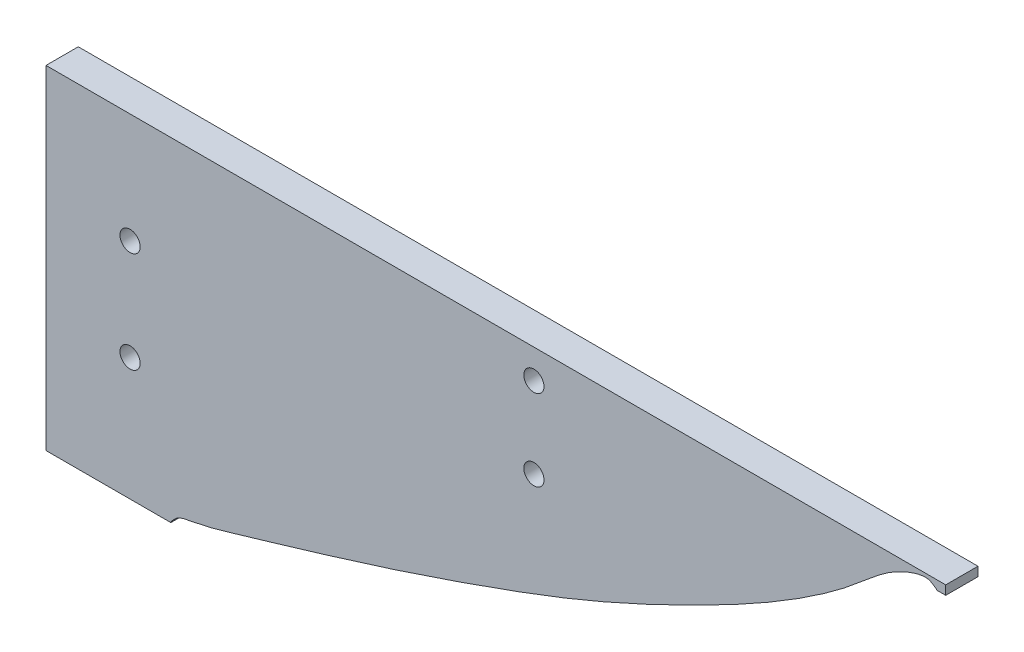
ISO-10303-21;
HEADER;
FILE_DESCRIPTION(('STEP AP214'),'2;1');
FILE_NAME('part.step','',(''),(''),'','','');
FILE_SCHEMA(('AUTOMOTIVE_DESIGN { 1 0 10303 214 1 1 1 1 }'));
ENDSEC;
DATA;
#1=APPLICATION_CONTEXT('core data for automotive mechanical design processes');
#2=APPLICATION_PROTOCOL_DEFINITION('international standard','automotive_design',2000,#1);
#3=PRODUCT_CONTEXT('',#1,'mechanical');
#4=PRODUCT('Part','Part','',(#3));
#5=PRODUCT_RELATED_PRODUCT_CATEGORY('part','',(#4));
#6=PRODUCT_DEFINITION_FORMATION('','',#4);
#7=PRODUCT_DEFINITION_CONTEXT('part definition',#1,'design');
#8=PRODUCT_DEFINITION('design','',#6,#7);
#9=PRODUCT_DEFINITION_SHAPE('','',#8);
#10=(LENGTH_UNIT() NAMED_UNIT(*) SI_UNIT(.MILLI.,.METRE.));
#11=(NAMED_UNIT(*) PLANE_ANGLE_UNIT() SI_UNIT($,.RADIAN.));
#12=(NAMED_UNIT(*) SI_UNIT($,.STERADIAN.) SOLID_ANGLE_UNIT());
#13=UNCERTAINTY_MEASURE_WITH_UNIT(LENGTH_MEASURE(1.E-05),#10,'distance_accuracy_value','');
#14=(GEOMETRIC_REPRESENTATION_CONTEXT(3) GLOBAL_UNCERTAINTY_ASSIGNED_CONTEXT((#13)) GLOBAL_UNIT_ASSIGNED_CONTEXT((#10,
#11,#12)) REPRESENTATION_CONTEXT('',''));
#15=CARTESIAN_POINT('',(0.,0.,0.));
#16=DIRECTION('',(0.,0.,1.));
#17=DIRECTION('',(1.,0.,0.));
#18=AXIS2_PLACEMENT_3D('',#15,#16,#17);
#19=CARTESIAN_POINT('',(8.85789585691385,-47.3159934518362,188.));
#20=DIRECTION('',(0.,0.,-1.));
#21=DIRECTION('',(-1.,0.,0.));
#22=AXIS2_PLACEMENT_3D('',#19,#20,#21);
#23=PLANE('',#22);
#24=CARTESIAN_POINT('',(-100.,-50.,188.));
#25=DIRECTION('',(0.,0.,-1.));
#26=DIRECTION('',(-1.,0.,0.));
#27=AXIS2_PLACEMENT_3D('',#24,#25,#26);
#28=CIRCLE('',#27,2.5);
#29=CARTESIAN_POINT('',(-102.5,-50.,188.));
#30=VERTEX_POINT('',#29);
#31=EDGE_CURVE('E249',#30,#30,#28,.F.);
#32=ORIENTED_EDGE('',*,*,#31,.F.);
#33=EDGE_LOOP('',(#32));
#34=FACE_BOUND('',#33,.T.);
#35=CARTESIAN_POINT('',(0.0705666698621599,-4.96037406111782,188.));
#36=DIRECTION('',(0.,0.,-1.));
#37=DIRECTION('',(-1.,0.,0.));
#38=AXIS2_PLACEMENT_3D('',#35,#36,#37);
#39=CIRCLE('',#38,2.5);
#40=CARTESIAN_POINT('',(-2.42943333013784,-4.96037406111782,188.));
#41=VERTEX_POINT('',#40);
#42=EDGE_CURVE('E159',#41,#41,#39,.F.);
#43=ORIENTED_EDGE('',*,*,#42,.F.);
#44=EDGE_LOOP('',(#43));
#45=FACE_BOUND('',#44,.T.);
#46=DIRECTION('',(0.,1.,0.));
#47=VECTOR('',#46,1.);
#48=CARTESIAN_POINT('',(102.117735243072,2.25600000000004,188.));
#49=LINE('',#48,#47);
#50=CARTESIAN_POINT('',(102.117735243072,0.,188.));
#51=VERTEX_POINT('',#50);
#52=CARTESIAN_POINT('',(102.117735243072,2.25600000000004,188.));
#53=VERTEX_POINT('',#52);
#54=EDGE_CURVE('E211',#51,#53,#49,.T.);
#55=ORIENTED_EDGE('',*,*,#54,.T.);
#56=DIRECTION('',(-1.,0.,0.));
#57=VECTOR('',#56,1.);
#58=CARTESIAN_POINT('',(102.117735243072,2.25600000000004,188.));
#59=LINE('',#58,#57);
#60=CARTESIAN_POINT('',(-120.833359637699,2.25600000000002,188.));
#61=VERTEX_POINT('',#60);
#62=EDGE_CURVE('E87',#53,#61,#59,.T.);
#63=ORIENTED_EDGE('',*,*,#62,.T.);
#64=DIRECTION('',(0.,-1.,0.));
#65=VECTOR('',#64,1.);
#66=CARTESIAN_POINT('',(-120.833359637699,-80.404842256038,188.));
#67=LINE('',#66,#65);
#68=CARTESIAN_POINT('',(-120.833359637699,-80.404842256038,188.));
#69=VERTEX_POINT('',#68);
#70=EDGE_CURVE('E102',#61,#69,#67,.T.);
#71=ORIENTED_EDGE('',*,*,#70,.T.);
#72=CARTESIAN_POINT('',(-89.8961585351522,-80.3915114601429,188.));
#73=CARTESIAN_POINT('',(-100.208558118564,-80.398016155977,188.));
#74=CARTESIAN_POINT('',(-110.520958548867,-80.4022947109246,188.));
#75=CARTESIAN_POINT('',(-120.833359637699,-80.404842256038,188.));
#76=B_SPLINE_CURVE_WITH_KNOTS('',3,(#72,#73,#74,#75),.UNSPECIFIED.,.F.,.F.,(4,4),(0.,1.),.UNSPECIFIED.);
#77=CARTESIAN_POINT('',(-89.8961585351522,-80.3915114601429,188.));
#78=VERTEX_POINT('',#77);
#79=EDGE_CURVE('E94',#69,#78,#76,.F.);
#80=ORIENTED_EDGE('',*,*,#79,.T.);
#81=CARTESIAN_POINT('',(99.8972580064843,0.,188.));
#82=CARTESIAN_POINT('',(99.8372291022672,0.126684717369278,188.));
#83=CARTESIAN_POINT('',(99.7380798015734,0.227502533582266,188.));
#84=CARTESIAN_POINT('',(99.5185521400411,0.398920738617617,188.));
#85=CARTESIAN_POINT('',(99.4015406937459,0.473658035235572,188.));
#86=CARTESIAN_POINT('',(99.0522078254634,0.700445697096749,188.));
#87=CARTESIAN_POINT('',(98.8242776674217,0.859970238810493,188.));
#88=CARTESIAN_POINT('',(98.458965477474,1.06124142229092,188.));
#89=CARTESIAN_POINT('',(98.3352189300717,1.12298737287147,188.));
#90=CARTESIAN_POINT('',(98.0802247126562,1.22618927725604,188.));
#91=CARTESIAN_POINT('',(97.9486192637095,1.26667746479552,188.));
#92=CARTESIAN_POINT('',(97.6778830835583,1.3272984929916,188.));
#93=CARTESIAN_POINT('',(97.5387461796722,1.34736057487209,188.));
#94=CARTESIAN_POINT('',(97.2630731839276,1.37022453940704,188.));
#95=CARTESIAN_POINT('',(97.1252963725242,1.37336382225603,188.));
#96=CARTESIAN_POINT('',(96.7120930360427,1.36512300747013,188.));
#97=CARTESIAN_POINT('',(96.4357857310863,1.33650883107121,188.));
#98=CARTESIAN_POINT('',(95.8880857083366,1.25464984204795,188.));
#99=CARTESIAN_POINT('',(95.6177288803112,1.20258011881214,188.));
#100=CARTESIAN_POINT('',(94.815619252394,1.01779358078617,188.));
#101=CARTESIAN_POINT('',(94.292922426488,0.856196054211814,188.));
#102=CARTESIAN_POINT('',(93.2587200842262,0.497310418679547,188.));
#103=CARTESIAN_POINT('',(92.7475072602376,0.299088874630363,188.));
#104=CARTESIAN_POINT('',(91.7357266069111,-0.131302524597235,188.));
#105=CARTESIAN_POINT('',(91.2361220304612,-0.362516223723358,188.));
#106=CARTESIAN_POINT('',(89.7681508350403,-1.09358805608304,188.));
#107=CARTESIAN_POINT('',(88.8259200935987,-1.6346466479162,188.));
#108=CARTESIAN_POINT('',(86.1046808659552,-3.41325759743066,188.));
#109=CARTESIAN_POINT('',(84.4256610739809,-4.79819087908625,188.));
#110=CARTESIAN_POINT('',(81.9315699834147,-6.91161270477184,188.));
#111=CARTESIAN_POINT('',(81.1033964799902,-7.62067138968554,188.));
#112=CARTESIAN_POINT('',(79.4326110045448,-9.01846289452286,188.));
#113=CARTESIAN_POINT('',(78.5915796901499,-9.70946225738709,188.));
#114=CARTESIAN_POINT('',(76.0383098283505,-11.7402013110498,188.));
#115=CARTESIAN_POINT('',(74.2940338474973,-13.035075059689,188.));
#116=CARTESIAN_POINT('',(70.7493363760023,-15.5461951226344,188.));
#117=CARTESIAN_POINT('',(68.9493495382136,-16.7630501345693,188.));
#118=CARTESIAN_POINT('',(65.3073153533384,-19.1378576754931,188.));
#119=CARTESIAN_POINT('',(63.4648484748493,-20.2952226832727,188.));
#120=CARTESIAN_POINT('',(59.7379418308398,-22.5511729240781,188.));
#121=CARTESIAN_POINT('',(57.8559708674029,-23.6491364248191,188.));
#122=CARTESIAN_POINT('',(52.1701836755763,-26.8685016883781,188.));
#123=CARTESIAN_POINT('',(48.3258202503481,-28.9209627726987,188.));
#124=CARTESIAN_POINT('',(40.5808359443055,-32.9124137657979,188.));
#125=CARTESIAN_POINT('',(36.6769712683242,-34.8486959910217,188.));
#126=CARTESIAN_POINT('',(28.8223883965726,-38.6166815555794,188.));
#127=CARTESIAN_POINT('',(24.8721726434184,-40.4507971091016,188.));
#128=CARTESIAN_POINT('',(16.9120003931111,-43.9890482163772,188.));
#129=CARTESIAN_POINT('',(12.8987682012111,-45.6895964435863,188.));
#130=CARTESIAN_POINT('',(4.81702351261668,-48.9423904600861,188.));
#131=CARTESIAN_POINT('',(0.748399288022606,-50.4965603824607,188.));
#132=CARTESIAN_POINT('',(-7.42360780532639,-53.5144373270439,188.));
#133=CARTESIAN_POINT('',(-11.5262399207433,-54.9810887985118,188.));
#134=CARTESIAN_POINT('',(-19.748712348184,-57.8617667950207,188.));
#135=CARTESIAN_POINT('',(-23.8693169631082,-59.2746212102784,188.));
#136=CARTESIAN_POINT('',(-32.1332312173208,-62.0337190884013,188.));
#137=CARTESIAN_POINT('',(-36.277166185536,-63.3788945010979,188.));
#138=CARTESIAN_POINT('',(-44.5855090277099,-66.0033343120342,188.));
#139=CARTESIAN_POINT('',(-48.7499702115824,-67.283063507594,188.));
#140=CARTESIAN_POINT('',(-57.0893430674413,-69.8078123568023,188.));
#141=CARTESIAN_POINT('',(-61.2637570492642,-71.0545285761993,188.));
#142=CARTESIAN_POINT('',(-67.5267201174031,-72.9200186734363,188.));
#143=CARTESIAN_POINT('',(-69.6148606687195,-73.5402132253959,188.));
#144=CARTESIAN_POINT('',(-72.7496090949382,-74.4618585363783,188.));
#145=CARTESIAN_POINT('',(-73.7949526007258,-74.7676194995014,188.));
#146=CARTESIAN_POINT('',(-75.8864409432908,-75.3764148304937,188.));
#147=CARTESIAN_POINT('',(-76.9318494036014,-75.6823918878134,188.));
#148=CARTESIAN_POINT('',(-79.0279425468115,-76.2737915001317,188.));
#149=CARTESIAN_POINT('',(-80.079483737098,-76.555855385209,188.));
#150=CARTESIAN_POINT('',(-81.6693197989054,-76.9300817767433,188.));
#151=CARTESIAN_POINT('',(-82.2013071951593,-77.0469890485778,188.));
#152=CARTESIAN_POINT('',(-83.2695127199782,-77.2637405782986,188.));
#153=CARTESIAN_POINT('',(-83.8061438560987,-77.360332204344,188.));
#154=CARTESIAN_POINT('',(-84.8805100372986,-77.5483704035671,188.));
#155=CARTESIAN_POINT('',(-85.4173978279938,-77.6437658246671,188.));
#156=CARTESIAN_POINT('',(-86.2147861171278,-77.8238812095655,188.));
#157=CARTESIAN_POINT('',(-86.4792964916047,-77.8899121102491,188.));
#158=CARTESIAN_POINT('',(-87.0041713193878,-78.0412970482152,188.));
#159=CARTESIAN_POINT('',(-87.2659521603041,-78.1277514055185,188.));
#160=CARTESIAN_POINT('',(-87.7717727339639,-78.3333049661856,188.));
#161=CARTESIAN_POINT('',(-88.0159321425748,-78.4522709655544,188.));
#162=CARTESIAN_POINT('',(-88.3627745450638,-78.6666040879848,188.));
#163=CARTESIAN_POINT('',(-88.4750972896707,-78.7441375682864,188.));
#164=CARTESIAN_POINT('',(-88.6921111586257,-78.9133231086337,188.));
#165=CARTESIAN_POINT('',(-88.7967656095049,-79.0043667367539,188.));
#166=CARTESIAN_POINT('',(-89.0980639196099,-79.2858466096739,188.));
#167=CARTESIAN_POINT('',(-89.2803839994927,-79.490414516694,188.));
#168=CARTESIAN_POINT('',(-89.5506040304607,-79.8002397889824,188.));
#169=CARTESIAN_POINT('',(-89.6394479418219,-79.9046362014644,188.));
#170=CARTESIAN_POINT('',(-89.7988271308397,-80.1301276837755,188.));
#171=CARTESIAN_POINT('',(-89.8682490828243,-80.2541204729949,188.));
#172=CARTESIAN_POINT('',(-89.8961585351522,-80.3915114601429,188.));
#173=B_SPLINE_CURVE_WITH_KNOTS('',3,(#81,#82,#83,#84,#85,#86,#87,#88,#89,#90,#91,#92,#93,#94,
#95,#96,#97,#98,#99,#100,#101,#102,#103,#104,#105,#106,#107,#108,#109,#110,#111,#112,#113,#114,
#115,#116,#117,#118,#119,#120,#121,#122,#123,#124,#125,#126,#127,#128,#129,#130,#131,#132,#133,
#134,#135,#136,#137,#138,#139,#140,#141,#142,#143,#144,#145,#146,#147,#148,#149,#150,#151,#152,
#153,#154,#155,#156,#157,#158,#159,#160,#161,#162,#163,#164,#165,#166,#167,#168,#169,#170,#171,
#172),.UNSPECIFIED.,.F.,.F.,(4,2,2,2,2,2,2,2,2,2,2,2,2,2,2,2,2,2,2,2,2,2,2,2,2,2,2,2,2,2,2,2,2,
2,2,2,2,2,2,2,2,2,2,2,2,4),(0.,0.001953125,0.00390625,0.00781250000000011,0.00976562500000011,
0.01171875,0.013671875,0.015625,0.01953125,0.0234374999999999,0.0312499999999999,
0.0390624999999998,0.0468749999999997,0.0624999999999997,0.0937499999999997,0.109375,0.125,
0.15625,0.1875,0.21875,0.25,0.3125,0.375,0.4375,0.5,0.5625,0.625,0.6875,0.75,0.8125,0.875,
0.90625,0.921875,0.9375,0.953125,0.9609375,0.96875,0.9765625,0.98046875,0.984375,0.98828125,
0.990234375,0.9921875,0.99609375,0.998046875,1.),.UNSPECIFIED.);
#174=CARTESIAN_POINT('',(99.8972580064843,0.,188.));
#175=VERTEX_POINT('',#174);
#176=EDGE_CURVE('E99',#78,#175,#173,.F.);
#177=ORIENTED_EDGE('',*,*,#176,.T.);
#178=DIRECTION('',(1.,0.,0.));
#179=VECTOR('',#178,1.);
#180=CARTESIAN_POINT('',(99.897258006484,0.,188.));
#181=LINE('',#180,#179);
#182=EDGE_CURVE('E49',#175,#51,#181,.T.);
#183=ORIENTED_EDGE('',*,*,#182,.T.);
#184=EDGE_LOOP('',(#55,#63,#71,#80,#177,#183));
#185=FACE_BOUND('',#184,.T.);
#186=CARTESIAN_POINT('',(0.0705666698621599,-25.,188.));
#187=DIRECTION('',(0.,0.,-1.));
#188=DIRECTION('',(-1.,0.,0.));
#189=AXIS2_PLACEMENT_3D('',#186,#187,#188);
#190=CIRCLE('',#189,2.5);
#191=CARTESIAN_POINT('',(-2.42943333013784,-25.,188.));
#192=VERTEX_POINT('',#191);
#193=EDGE_CURVE('E256',#192,#192,#190,.F.);
#194=ORIENTED_EDGE('',*,*,#193,.F.);
#195=EDGE_LOOP('',(#194));
#196=FACE_BOUND('',#195,.T.);
#197=CARTESIAN_POINT('',(-100.,-25.,188.));
#198=DIRECTION('',(0.,0.,-1.));
#199=DIRECTION('',(-1.,0.,0.));
#200=AXIS2_PLACEMENT_3D('',#197,#198,#199);
#201=CIRCLE('',#200,2.5);
#202=CARTESIAN_POINT('',(-102.5,-25.,188.));
#203=VERTEX_POINT('',#202);
#204=EDGE_CURVE('E279',#203,#203,#201,.F.);
#205=ORIENTED_EDGE('',*,*,#204,.F.);
#206=EDGE_LOOP('',(#205));
#207=FACE_BOUND('',#206,.T.);
#208=ADVANCED_FACE('F30',(#34,#45,#185,#196,#207),#23,.F.);
#209=CARTESIAN_POINT('',(8.85789585691385,-47.3159934518362,180.));
#210=DIRECTION('',(0.,0.,-1.));
#211=DIRECTION('',(-1.,0.,0.));
#212=AXIS2_PLACEMENT_3D('',#209,#210,#211);
#213=PLANE('',#212);
#214=CARTESIAN_POINT('',(-100.,-50.,180.));
#215=DIRECTION('',(0.,0.,-1.));
#216=DIRECTION('',(-1.,0.,0.));
#217=AXIS2_PLACEMENT_3D('',#214,#215,#216);
#218=CIRCLE('',#217,2.5);
#219=CARTESIAN_POINT('',(-102.5,-50.,180.));
#220=VERTEX_POINT('',#219);
#221=EDGE_CURVE('E278',#220,#220,#218,.F.);
#222=ORIENTED_EDGE('',*,*,#221,.T.);
#223=EDGE_LOOP('',(#222));
#224=FACE_BOUND('',#223,.T.);
#225=CARTESIAN_POINT('',(0.0705666698621599,-4.96037406111782,180.));
#226=DIRECTION('',(0.,0.,-1.));
#227=DIRECTION('',(-1.,0.,0.));
#228=AXIS2_PLACEMENT_3D('',#225,#226,#227);
#229=CIRCLE('',#228,2.5);
#230=CARTESIAN_POINT('',(-2.42943333013784,-4.96037406111782,180.));
#231=VERTEX_POINT('',#230);
#232=EDGE_CURVE('E253',#231,#231,#229,.F.);
#233=ORIENTED_EDGE('',*,*,#232,.T.);
#234=EDGE_LOOP('',(#233));
#235=FACE_BOUND('',#234,.T.);
#236=DIRECTION('',(0.,1.,0.));
#237=VECTOR('',#236,1.);
#238=CARTESIAN_POINT('',(102.117735243072,2.25600000000004,180.));
#239=LINE('',#238,#237);
#240=CARTESIAN_POINT('',(102.117735243072,0.,180.));
#241=VERTEX_POINT('',#240);
#242=CARTESIAN_POINT('',(102.117735243072,2.25600000000004,180.));
#243=VERTEX_POINT('',#242);
#244=EDGE_CURVE('E152',#241,#243,#239,.T.);
#245=ORIENTED_EDGE('',*,*,#244,.F.);
#246=DIRECTION('',(1.,0.,0.));
#247=VECTOR('',#246,1.);
#248=CARTESIAN_POINT('',(99.897258006484,0.,180.));
#249=LINE('',#248,#247);
#250=CARTESIAN_POINT('',(99.8972580064843,0.,180.));
#251=VERTEX_POINT('',#250);
#252=EDGE_CURVE('E79',#251,#241,#249,.T.);
#253=ORIENTED_EDGE('',*,*,#252,.F.);
#254=CARTESIAN_POINT('',(-89.8961585351522,-80.3915114601429,180.));
#255=CARTESIAN_POINT('',(-89.8682490828243,-80.2541204729949,180.));
#256=CARTESIAN_POINT('',(-89.7988271308397,-80.1301276837755,180.));
#257=CARTESIAN_POINT('',(-89.6394479418219,-79.9046362014644,180.));
#258=CARTESIAN_POINT('',(-89.5506040304607,-79.8002397889824,180.));
#259=CARTESIAN_POINT('',(-89.2803839994927,-79.490414516694,180.));
#260=CARTESIAN_POINT('',(-89.0980639196099,-79.2858466096739,180.));
#261=CARTESIAN_POINT('',(-88.7967656095049,-79.0043667367539,180.));
#262=CARTESIAN_POINT('',(-88.6921111586257,-78.9133231086337,180.));
#263=CARTESIAN_POINT('',(-88.4750972896707,-78.7441375682864,180.));
#264=CARTESIAN_POINT('',(-88.3627745450638,-78.6666040879848,180.));
#265=CARTESIAN_POINT('',(-88.0159321425748,-78.4522709655544,180.));
#266=CARTESIAN_POINT('',(-87.7717727339639,-78.3333049661856,180.));
#267=CARTESIAN_POINT('',(-87.2659521603041,-78.1277514055185,180.));
#268=CARTESIAN_POINT('',(-87.0041713193878,-78.0412970482152,180.));
#269=CARTESIAN_POINT('',(-86.4792964916047,-77.8899121102491,180.));
#270=CARTESIAN_POINT('',(-86.2147861171278,-77.8238812095655,180.));
#271=CARTESIAN_POINT('',(-85.4173978279938,-77.6437658246671,180.));
#272=CARTESIAN_POINT('',(-84.8805100372986,-77.5483704035671,180.));
#273=CARTESIAN_POINT('',(-83.8061438560987,-77.360332204344,180.));
#274=CARTESIAN_POINT('',(-83.2695127199782,-77.2637405782986,180.));
#275=CARTESIAN_POINT('',(-82.2013071951593,-77.0469890485778,180.));
#276=CARTESIAN_POINT('',(-81.6693197989054,-76.9300817767433,180.));
#277=CARTESIAN_POINT('',(-80.079483737098,-76.555855385209,180.));
#278=CARTESIAN_POINT('',(-79.0279425468115,-76.2737915001317,180.));
#279=CARTESIAN_POINT('',(-76.9318494036014,-75.6823918878134,180.));
#280=CARTESIAN_POINT('',(-75.8864409432908,-75.3764148304937,180.));
#281=CARTESIAN_POINT('',(-73.7949526007258,-74.7676194995014,180.));
#282=CARTESIAN_POINT('',(-72.7496090949382,-74.4618585363783,180.));
#283=CARTESIAN_POINT('',(-69.6148606687195,-73.5402132253959,180.));
#284=CARTESIAN_POINT('',(-67.5267201174031,-72.9200186734363,180.));
#285=CARTESIAN_POINT('',(-61.2637570492642,-71.0545285761993,180.));
#286=CARTESIAN_POINT('',(-57.0893430674413,-69.8078123568023,180.));
#287=CARTESIAN_POINT('',(-48.7499702115824,-67.283063507594,180.));
#288=CARTESIAN_POINT('',(-44.5855090277099,-66.0033343120342,180.));
#289=CARTESIAN_POINT('',(-36.277166185536,-63.3788945010979,180.));
#290=CARTESIAN_POINT('',(-32.1332312173208,-62.0337190884013,180.));
#291=CARTESIAN_POINT('',(-23.8693169631082,-59.2746212102784,180.));
#292=CARTESIAN_POINT('',(-19.748712348184,-57.8617667950207,180.));
#293=CARTESIAN_POINT('',(-11.5262399207433,-54.9810887985118,180.));
#294=CARTESIAN_POINT('',(-7.42360780532639,-53.5144373270439,180.));
#295=CARTESIAN_POINT('',(0.748399288022606,-50.4965603824607,180.));
#296=CARTESIAN_POINT('',(4.81702351261668,-48.9423904600861,180.));
#297=CARTESIAN_POINT('',(12.8987682012111,-45.6895964435863,180.));
#298=CARTESIAN_POINT('',(16.9120003931111,-43.9890482163772,180.));
#299=CARTESIAN_POINT('',(24.8721726434184,-40.4507971091016,180.));
#300=CARTESIAN_POINT('',(28.8223883965726,-38.6166815555794,180.));
#301=CARTESIAN_POINT('',(36.6769712683242,-34.8486959910217,180.));
#302=CARTESIAN_POINT('',(40.5808359443055,-32.9124137657979,180.));
#303=CARTESIAN_POINT('',(48.3258202503481,-28.9209627726987,180.));
#304=CARTESIAN_POINT('',(52.1701836755763,-26.8685016883781,180.));
#305=CARTESIAN_POINT('',(57.8559708674029,-23.6491364248191,180.));
#306=CARTESIAN_POINT('',(59.7379418308398,-22.5511729240781,180.));
#307=CARTESIAN_POINT('',(63.4648484748493,-20.2952226832727,180.));
#308=CARTESIAN_POINT('',(65.3073153533384,-19.1378576754931,180.));
#309=CARTESIAN_POINT('',(68.9493495382136,-16.7630501345693,180.));
#310=CARTESIAN_POINT('',(70.7493363760023,-15.5461951226344,180.));
#311=CARTESIAN_POINT('',(74.2940338474973,-13.035075059689,180.));
#312=CARTESIAN_POINT('',(76.0383098283505,-11.7402013110498,180.));
#313=CARTESIAN_POINT('',(78.5915796901499,-9.70946225738709,180.));
#314=CARTESIAN_POINT('',(79.4326110045448,-9.01846289452286,180.));
#315=CARTESIAN_POINT('',(81.1033964799902,-7.62067138968554,180.));
#316=CARTESIAN_POINT('',(81.9315699834147,-6.91161270477184,180.));
#317=CARTESIAN_POINT('',(84.4256610739809,-4.79819087908625,180.));
#318=CARTESIAN_POINT('',(86.1046808659552,-3.41325759743066,180.));
#319=CARTESIAN_POINT('',(88.8259200935987,-1.6346466479162,180.));
#320=CARTESIAN_POINT('',(89.7681508350403,-1.09358805608304,180.));
#321=CARTESIAN_POINT('',(91.2361220304612,-0.362516223723358,180.));
#322=CARTESIAN_POINT('',(91.7357266069111,-0.131302524597235,180.));
#323=CARTESIAN_POINT('',(92.7475072602376,0.299088874630363,180.));
#324=CARTESIAN_POINT('',(93.2587200842262,0.497310418679547,180.));
#325=CARTESIAN_POINT('',(94.292922426488,0.856196054211814,180.));
#326=CARTESIAN_POINT('',(94.815619252394,1.01779358078617,180.));
#327=CARTESIAN_POINT('',(95.6177288803112,1.20258011881214,180.));
#328=CARTESIAN_POINT('',(95.8880857083366,1.25464984204795,180.));
#329=CARTESIAN_POINT('',(96.4357857310863,1.33650883107121,180.));
#330=CARTESIAN_POINT('',(96.7120930360427,1.36512300747013,180.));
#331=CARTESIAN_POINT('',(97.1252963725242,1.37336382225603,180.));
#332=CARTESIAN_POINT('',(97.2630731839276,1.37022453940704,180.));
#333=CARTESIAN_POINT('',(97.5387461796722,1.34736057487209,180.));
#334=CARTESIAN_POINT('',(97.6778830835583,1.3272984929916,180.));
#335=CARTESIAN_POINT('',(97.9486192637095,1.26667746479552,180.));
#336=CARTESIAN_POINT('',(98.0802247126562,1.22618927725604,180.));
#337=CARTESIAN_POINT('',(98.3352189300717,1.12298737287147,180.));
#338=CARTESIAN_POINT('',(98.458965477474,1.06124142229092,180.));
#339=CARTESIAN_POINT('',(98.8242776674217,0.859970238810493,180.));
#340=CARTESIAN_POINT('',(99.0522078254634,0.700445697096749,180.));
#341=CARTESIAN_POINT('',(99.4015406937459,0.473658035235572,180.));
#342=CARTESIAN_POINT('',(99.5185521400411,0.398920738617617,180.));
#343=CARTESIAN_POINT('',(99.7380798015734,0.227502533582266,180.));
#344=CARTESIAN_POINT('',(99.8372291022672,0.126684717369278,180.));
#345=CARTESIAN_POINT('',(99.8972580064843,0.,180.));
#346=B_SPLINE_CURVE_WITH_KNOTS('',3,(#254,#255,#256,#257,#258,#259,#260,#261,#262,#263,#264,
#265,#266,#267,#268,#269,#270,#271,#272,#273,#274,#275,#276,#277,#278,#279,#280,#281,#282,#283,
#284,#285,#286,#287,#288,#289,#290,#291,#292,#293,#294,#295,#296,#297,#298,#299,#300,#301,#302,
#303,#304,#305,#306,#307,#308,#309,#310,#311,#312,#313,#314,#315,#316,#317,#318,#319,#320,#321,
#322,#323,#324,#325,#326,#327,#328,#329,#330,#331,#332,#333,#334,#335,#336,#337,#338,#339,#340,
#341,#342,#343,#344,#345),.UNSPECIFIED.,.F.,.F.,(4,2,2,2,2,2,2,2,2,2,2,2,2,2,2,2,2,2,2,2,2,2,2,
2,2,2,2,2,2,2,2,2,2,2,2,2,2,2,2,2,2,2,2,2,2,4),(0.,0.001953125,0.00390625,0.00781249999999989,
0.00976562499999978,0.0117187499999997,0.0156249999999997,0.0195312499999996,0.0234374999999996,
0.0312499999999996,0.0390624999999997,0.0468749999999997,0.0624999999999997,0.0781249999999996,
0.0937499999999996,0.125,0.1875,0.25,0.3125,0.375,0.4375,0.5,0.5625,0.625,0.6875,0.75,0.78125,
0.8125,0.84375,0.875,0.890625,0.90625,0.9375,0.953125,0.9609375,0.96875,0.9765625,0.98046875,
0.984375,0.986328125,0.98828125,0.990234375,0.9921875,0.99609375,0.998046875,1.),.UNSPECIFIED.);
#347=CARTESIAN_POINT('',(-89.8961585351522,-80.3915114601429,180.));
#348=VERTEX_POINT('',#347);
#349=EDGE_CURVE('E72',#348,#251,#346,.T.);
#350=ORIENTED_EDGE('',*,*,#349,.F.);
#351=CARTESIAN_POINT('',(-120.833359637699,-80.404842256038,180.));
#352=CARTESIAN_POINT('',(-110.520958548867,-80.4022947109246,180.));
#353=CARTESIAN_POINT('',(-100.208558118564,-80.398016155977,180.));
#354=CARTESIAN_POINT('',(-89.8961585351522,-80.3915114601429,180.));
#355=B_SPLINE_CURVE_WITH_KNOTS('',3,(#351,#352,#353,#354),.UNSPECIFIED.,.F.,.F.,(4,4),(0.,1.),.UNSPECIFIED.);
#356=CARTESIAN_POINT('',(-120.833359637699,-80.404842256038,180.));
#357=VERTEX_POINT('',#356);
#358=EDGE_CURVE('E112',#357,#348,#355,.T.);
#359=ORIENTED_EDGE('',*,*,#358,.F.);
#360=DIRECTION('',(0.,-1.,0.));
#361=VECTOR('',#360,1.);
#362=CARTESIAN_POINT('',(-120.833359637699,-80.404842256038,180.));
#363=LINE('',#362,#361);
#364=CARTESIAN_POINT('',(-120.833359637699,2.25600000000002,180.));
#365=VERTEX_POINT('',#364);
#366=EDGE_CURVE('E161',#365,#357,#363,.T.);
#367=ORIENTED_EDGE('',*,*,#366,.F.);
#368=DIRECTION('',(-1.,0.,0.));
#369=VECTOR('',#368,1.);
#370=CARTESIAN_POINT('',(102.117735243072,2.25600000000004,180.));
#371=LINE('',#370,#369);
#372=EDGE_CURVE('E158',#243,#365,#371,.T.);
#373=ORIENTED_EDGE('',*,*,#372,.F.);
#374=EDGE_LOOP('',(#245,#253,#350,#359,#367,#373));
#375=FACE_BOUND('',#374,.T.);
#376=CARTESIAN_POINT('',(0.0705666698621599,-25.,180.));
#377=DIRECTION('',(0.,0.,-1.));
#378=DIRECTION('',(-1.,0.,0.));
#379=AXIS2_PLACEMENT_3D('',#376,#377,#378);
#380=CIRCLE('',#379,2.5);
#381=CARTESIAN_POINT('',(-2.42943333013784,-25.,180.));
#382=VERTEX_POINT('',#381);
#383=EDGE_CURVE('E276',#382,#382,#380,.F.);
#384=ORIENTED_EDGE('',*,*,#383,.T.);
#385=EDGE_LOOP('',(#384));
#386=FACE_BOUND('',#385,.T.);
#387=CARTESIAN_POINT('',(-100.,-25.,180.));
#388=DIRECTION('',(0.,0.,-1.));
#389=DIRECTION('',(-1.,0.,0.));
#390=AXIS2_PLACEMENT_3D('',#387,#388,#389);
#391=CIRCLE('',#390,2.5);
#392=CARTESIAN_POINT('',(-102.5,-25.,180.));
#393=VERTEX_POINT('',#392);
#394=EDGE_CURVE('E34',#393,#393,#391,.F.);
#395=ORIENTED_EDGE('',*,*,#394,.T.);
#396=EDGE_LOOP('',(#395));
#397=FACE_BOUND('',#396,.T.);
#398=ADVANCED_FACE('F188',(#224,#235,#375,#386,#397),#213,.T.);
#399=CARTESIAN_POINT('',(102.117735243072,2.25600000000004,188.));
#400=DIRECTION('',(-1.,0.,0.));
#401=DIRECTION('',(0.,0.,1.));
#402=AXIS2_PLACEMENT_3D('',#399,#400,#401);
#403=PLANE('',#402);
#404=ORIENTED_EDGE('',*,*,#244,.T.);
#405=DIRECTION('',(0.,0.,-1.));
#406=VECTOR('',#405,1.);
#407=CARTESIAN_POINT('',(102.117735243072,2.25600000000004,188.));
#408=LINE('',#407,#406);
#409=EDGE_CURVE('E11',#53,#243,#408,.T.);
#410=ORIENTED_EDGE('',*,*,#409,.F.);
#411=ORIENTED_EDGE('',*,*,#54,.F.);
#412=DIRECTION('',(0.,0.,-1.));
#413=VECTOR('',#412,1.);
#414=CARTESIAN_POINT('',(102.117735243072,0.,188.));
#415=LINE('',#414,#413);
#416=EDGE_CURVE('E162',#51,#241,#415,.T.);
#417=ORIENTED_EDGE('',*,*,#416,.T.);
#418=EDGE_LOOP('',(#404,#410,#411,#417));
#419=FACE_BOUND('',#418,.T.);
#420=ADVANCED_FACE('F32',(#419),#403,.F.);
#421=CARTESIAN_POINT('',(102.117735243072,2.25600000000004,188.));
#422=DIRECTION('',(0.,-1.,0.));
#423=DIRECTION('',(1.,0.,0.));
#424=AXIS2_PLACEMENT_3D('',#421,#422,#423);
#425=PLANE('',#424);
#426=ORIENTED_EDGE('',*,*,#372,.T.);
#427=DIRECTION('',(0.,0.,-1.));
#428=VECTOR('',#427,1.);
#429=CARTESIAN_POINT('',(-120.833359637699,2.25600000000002,188.));
#430=LINE('',#429,#428);
#431=EDGE_CURVE('E40',#61,#365,#430,.T.);
#432=ORIENTED_EDGE('',*,*,#431,.F.);
#433=ORIENTED_EDGE('',*,*,#62,.F.);
#434=ORIENTED_EDGE('',*,*,#409,.T.);
#435=EDGE_LOOP('',(#426,#432,#433,#434));
#436=FACE_BOUND('',#435,.T.);
#437=ADVANCED_FACE('F218',(#436),#425,.F.);
#438=CARTESIAN_POINT('',(-120.833359637699,-80.404842256038,188.));
#439=DIRECTION('',(1.,0.,0.));
#440=DIRECTION('',(0.,0.,-1.));
#441=AXIS2_PLACEMENT_3D('',#438,#439,#440);
#442=PLANE('',#441);
#443=ORIENTED_EDGE('',*,*,#366,.T.);
#444=DIRECTION('',(0.,0.,-1.));
#445=VECTOR('',#444,1.);
#446=CARTESIAN_POINT('',(-120.833359637699,-80.404842256038,188.));
#447=LINE('',#446,#445);
#448=EDGE_CURVE('E114',#69,#357,#447,.T.);
#449=ORIENTED_EDGE('',*,*,#448,.F.);
#450=ORIENTED_EDGE('',*,*,#70,.F.);
#451=ORIENTED_EDGE('',*,*,#431,.T.);
#452=EDGE_LOOP('',(#443,#449,#450,#451));
#453=FACE_BOUND('',#452,.T.);
#454=ADVANCED_FACE('F214',(#453),#442,.F.);
#455=CARTESIAN_POINT('',(-120.833359637699,-80.404842256038,188.));
#456=CARTESIAN_POINT('',(-110.520958548867,-80.4022947109246,188.));
#457=CARTESIAN_POINT('',(-100.208558118564,-80.398016155977,188.));
#458=CARTESIAN_POINT('',(-89.8961585351522,-80.3915114601429,188.));
#459=B_SPLINE_CURVE_WITH_KNOTS('',3,(#455,#456,#457,#458),.UNSPECIFIED.,.F.,.F.,(4,4),(0.,1.),.UNSPECIFIED.);
#460=DIRECTION('',(0.,0.,-1.));
#461=VECTOR('',#460,1.);
#462=SURFACE_OF_LINEAR_EXTRUSION('',#459,#461);
#463=ORIENTED_EDGE('',*,*,#358,.T.);
#464=DIRECTION('',(0.,0.,-1.));
#465=VECTOR('',#464,1.);
#466=CARTESIAN_POINT('',(-89.8961585351522,-80.3915114601429,188.));
#467=LINE('',#466,#465);
#468=EDGE_CURVE('E109',#78,#348,#467,.T.);
#469=ORIENTED_EDGE('',*,*,#468,.F.);
#470=ORIENTED_EDGE('',*,*,#79,.F.);
#471=ORIENTED_EDGE('',*,*,#448,.T.);
#472=EDGE_LOOP('',(#463,#469,#470,#471));
#473=FACE_BOUND('',#472,.T.);
#474=ADVANCED_FACE('F110',(#473),#462,.F.);
#475=CARTESIAN_POINT('',(-89.8961585351522,-80.3915114601429,188.));
#476=CARTESIAN_POINT('',(-89.8682490828243,-80.2541204729949,188.));
#477=CARTESIAN_POINT('',(-89.7988271308397,-80.1301276837755,188.));
#478=CARTESIAN_POINT('',(-89.6394479418219,-79.9046362014644,188.));
#479=CARTESIAN_POINT('',(-89.5506040304607,-79.8002397889824,188.));
#480=CARTESIAN_POINT('',(-89.2803839994927,-79.490414516694,188.));
#481=CARTESIAN_POINT('',(-89.0980639196099,-79.2858466096739,188.));
#482=CARTESIAN_POINT('',(-88.7967656095049,-79.0043667367539,188.));
#483=CARTESIAN_POINT('',(-88.6921111586257,-78.9133231086337,188.));
#484=CARTESIAN_POINT('',(-88.4750972896707,-78.7441375682864,188.));
#485=CARTESIAN_POINT('',(-88.3627745450638,-78.6666040879848,188.));
#486=CARTESIAN_POINT('',(-88.0159321425748,-78.4522709655544,188.));
#487=CARTESIAN_POINT('',(-87.7717727339639,-78.3333049661856,188.));
#488=CARTESIAN_POINT('',(-87.2659521603041,-78.1277514055185,188.));
#489=CARTESIAN_POINT('',(-87.0041713193878,-78.0412970482152,188.));
#490=CARTESIAN_POINT('',(-86.4792964916047,-77.8899121102491,188.));
#491=CARTESIAN_POINT('',(-86.2147861171278,-77.8238812095655,188.));
#492=CARTESIAN_POINT('',(-85.4173978279938,-77.6437658246671,188.));
#493=CARTESIAN_POINT('',(-84.8805100372986,-77.5483704035671,188.));
#494=CARTESIAN_POINT('',(-83.8061438560987,-77.360332204344,188.));
#495=CARTESIAN_POINT('',(-83.2695127199782,-77.2637405782986,188.));
#496=CARTESIAN_POINT('',(-82.2013071951593,-77.0469890485778,188.));
#497=CARTESIAN_POINT('',(-81.6693197989054,-76.9300817767433,188.));
#498=CARTESIAN_POINT('',(-80.079483737098,-76.555855385209,188.));
#499=CARTESIAN_POINT('',(-79.0279425468115,-76.2737915001317,188.));
#500=CARTESIAN_POINT('',(-76.9318494036014,-75.6823918878134,188.));
#501=CARTESIAN_POINT('',(-75.8864409432908,-75.3764148304937,188.));
#502=CARTESIAN_POINT('',(-73.7949526007258,-74.7676194995014,188.));
#503=CARTESIAN_POINT('',(-72.7496090949382,-74.4618585363783,188.));
#504=CARTESIAN_POINT('',(-69.6148606687195,-73.5402132253959,188.));
#505=CARTESIAN_POINT('',(-67.5267201174031,-72.9200186734363,188.));
#506=CARTESIAN_POINT('',(-61.2637570492642,-71.0545285761993,188.));
#507=CARTESIAN_POINT('',(-57.0893430674413,-69.8078123568023,188.));
#508=CARTESIAN_POINT('',(-48.7499702115824,-67.283063507594,188.));
#509=CARTESIAN_POINT('',(-44.5855090277099,-66.0033343120342,188.));
#510=CARTESIAN_POINT('',(-36.277166185536,-63.3788945010979,188.));
#511=CARTESIAN_POINT('',(-32.1332312173208,-62.0337190884013,188.));
#512=CARTESIAN_POINT('',(-23.8693169631082,-59.2746212102784,188.));
#513=CARTESIAN_POINT('',(-19.748712348184,-57.8617667950207,188.));
#514=CARTESIAN_POINT('',(-11.5262399207433,-54.9810887985118,188.));
#515=CARTESIAN_POINT('',(-7.42360780532639,-53.5144373270439,188.));
#516=CARTESIAN_POINT('',(0.748399288022606,-50.4965603824607,188.));
#517=CARTESIAN_POINT('',(4.81702351261668,-48.9423904600861,188.));
#518=CARTESIAN_POINT('',(12.8987682012111,-45.6895964435863,188.));
#519=CARTESIAN_POINT('',(16.9120003931111,-43.9890482163772,188.));
#520=CARTESIAN_POINT('',(24.8721726434184,-40.4507971091016,188.));
#521=CARTESIAN_POINT('',(28.8223883965726,-38.6166815555794,188.));
#522=CARTESIAN_POINT('',(36.6769712683242,-34.8486959910217,188.));
#523=CARTESIAN_POINT('',(40.5808359443055,-32.9124137657979,188.));
#524=CARTESIAN_POINT('',(48.3258202503481,-28.9209627726987,188.));
#525=CARTESIAN_POINT('',(52.1701836755763,-26.8685016883781,188.));
#526=CARTESIAN_POINT('',(57.8559708674029,-23.6491364248191,188.));
#527=CARTESIAN_POINT('',(59.7379418308398,-22.5511729240781,188.));
#528=CARTESIAN_POINT('',(63.4648484748493,-20.2952226832727,188.));
#529=CARTESIAN_POINT('',(65.3073153533384,-19.1378576754931,188.));
#530=CARTESIAN_POINT('',(68.9493495382136,-16.7630501345693,188.));
#531=CARTESIAN_POINT('',(70.7493363760023,-15.5461951226344,188.));
#532=CARTESIAN_POINT('',(74.2940338474973,-13.035075059689,188.));
#533=CARTESIAN_POINT('',(76.0383098283505,-11.7402013110498,188.));
#534=CARTESIAN_POINT('',(78.5915796901499,-9.70946225738709,188.));
#535=CARTESIAN_POINT('',(79.4326110045448,-9.01846289452286,188.));
#536=CARTESIAN_POINT('',(81.1033964799902,-7.62067138968554,188.));
#537=CARTESIAN_POINT('',(81.9315699834147,-6.91161270477184,188.));
#538=CARTESIAN_POINT('',(84.4256610739809,-4.79819087908625,188.));
#539=CARTESIAN_POINT('',(86.1046808659552,-3.41325759743066,188.));
#540=CARTESIAN_POINT('',(88.8259200935987,-1.6346466479162,188.));
#541=CARTESIAN_POINT('',(89.7681508350403,-1.09358805608304,188.));
#542=CARTESIAN_POINT('',(91.2361220304612,-0.362516223723358,188.));
#543=CARTESIAN_POINT('',(91.7357266069111,-0.131302524597235,188.));
#544=CARTESIAN_POINT('',(92.7475072602376,0.299088874630363,188.));
#545=CARTESIAN_POINT('',(93.2587200842262,0.497310418679547,188.));
#546=CARTESIAN_POINT('',(94.292922426488,0.856196054211814,188.));
#547=CARTESIAN_POINT('',(94.815619252394,1.01779358078617,188.));
#548=CARTESIAN_POINT('',(95.6177288803112,1.20258011881214,188.));
#549=CARTESIAN_POINT('',(95.8880857083366,1.25464984204795,188.));
#550=CARTESIAN_POINT('',(96.4357857310863,1.33650883107121,188.));
#551=CARTESIAN_POINT('',(96.7120930360427,1.36512300747013,188.));
#552=CARTESIAN_POINT('',(97.1252963725242,1.37336382225603,188.));
#553=CARTESIAN_POINT('',(97.2630731839276,1.37022453940704,188.));
#554=CARTESIAN_POINT('',(97.5387461796722,1.34736057487209,188.));
#555=CARTESIAN_POINT('',(97.6778830835583,1.3272984929916,188.));
#556=CARTESIAN_POINT('',(97.9486192637095,1.26667746479552,188.));
#557=CARTESIAN_POINT('',(98.0802247126562,1.22618927725604,188.));
#558=CARTESIAN_POINT('',(98.3352189300717,1.12298737287147,188.));
#559=CARTESIAN_POINT('',(98.458965477474,1.06124142229092,188.));
#560=CARTESIAN_POINT('',(98.8242776674217,0.859970238810493,188.));
#561=CARTESIAN_POINT('',(99.0522078254634,0.700445697096749,188.));
#562=CARTESIAN_POINT('',(99.4015406937459,0.473658035235572,188.));
#563=CARTESIAN_POINT('',(99.5185521400411,0.398920738617617,188.));
#564=CARTESIAN_POINT('',(99.7380798015734,0.227502533582266,188.));
#565=CARTESIAN_POINT('',(99.8372291022672,0.126684717369278,188.));
#566=CARTESIAN_POINT('',(99.8972580064843,0.,188.));
#567=B_SPLINE_CURVE_WITH_KNOTS('',3,(#475,#476,#477,#478,#479,#480,#481,#482,#483,#484,#485,
#486,#487,#488,#489,#490,#491,#492,#493,#494,#495,#496,#497,#498,#499,#500,#501,#502,#503,#504,
#505,#506,#507,#508,#509,#510,#511,#512,#513,#514,#515,#516,#517,#518,#519,#520,#521,#522,#523,
#524,#525,#526,#527,#528,#529,#530,#531,#532,#533,#534,#535,#536,#537,#538,#539,#540,#541,#542,
#543,#544,#545,#546,#547,#548,#549,#550,#551,#552,#553,#554,#555,#556,#557,#558,#559,#560,#561,
#562,#563,#564,#565,#566),.UNSPECIFIED.,.F.,.F.,(4,2,2,2,2,2,2,2,2,2,2,2,2,2,2,2,2,2,2,2,2,2,2,
2,2,2,2,2,2,2,2,2,2,2,2,2,2,2,2,2,2,2,2,2,2,4),(0.,0.001953125,0.00390625,0.00781249999999989,
0.00976562499999978,0.0117187499999997,0.0156249999999997,0.0195312499999996,0.0234374999999996,
0.0312499999999996,0.0390624999999997,0.0468749999999997,0.0624999999999997,0.0781249999999996,
0.0937499999999996,0.125,0.1875,0.25,0.3125,0.375,0.4375,0.5,0.5625,0.625,0.6875,0.75,0.78125,
0.8125,0.84375,0.875,0.890625,0.90625,0.9375,0.953125,0.9609375,0.96875,0.9765625,0.98046875,
0.984375,0.986328125,0.98828125,0.990234375,0.9921875,0.99609375,0.998046875,1.),.UNSPECIFIED.);
#568=DIRECTION('',(0.,0.,-1.));
#569=VECTOR('',#568,1.);
#570=SURFACE_OF_LINEAR_EXTRUSION('',#567,#569);
#571=ORIENTED_EDGE('',*,*,#349,.T.);
#572=DIRECTION('',(0.,0.,-1.));
#573=VECTOR('',#572,1.);
#574=CARTESIAN_POINT('',(99.8972580064843,0.,188.));
#575=LINE('',#574,#573);
#576=EDGE_CURVE('E115',#175,#251,#575,.T.);
#577=ORIENTED_EDGE('',*,*,#576,.F.);
#578=ORIENTED_EDGE('',*,*,#176,.F.);
#579=ORIENTED_EDGE('',*,*,#468,.T.);
#580=EDGE_LOOP('',(#571,#577,#578,#579));
#581=FACE_BOUND('',#580,.T.);
#582=ADVANCED_FACE('F118',(#581),#570,.F.);
#583=CARTESIAN_POINT('',(99.897258006484,0.,188.));
#584=DIRECTION('',(0.,1.,0.));
#585=DIRECTION('',(-1.,0.,0.));
#586=AXIS2_PLACEMENT_3D('',#583,#584,#585);
#587=PLANE('',#586);
#588=ORIENTED_EDGE('',*,*,#252,.T.);
#589=ORIENTED_EDGE('',*,*,#416,.F.);
#590=ORIENTED_EDGE('',*,*,#182,.F.);
#591=ORIENTED_EDGE('',*,*,#576,.T.);
#592=EDGE_LOOP('',(#588,#589,#590,#591));
#593=FACE_BOUND('',#592,.T.);
#594=ADVANCED_FACE('F138',(#593),#587,.F.);
#595=CARTESIAN_POINT('',(0.0705666698621599,-4.96037406111782,308.));
#596=DIRECTION('',(0.,0.,-1.));
#597=DIRECTION('',(-1.,0.,0.));
#598=AXIS2_PLACEMENT_3D('',#595,#596,#597);
#599=CYLINDRICAL_SURFACE('',#598,2.5);
#600=ORIENTED_EDGE('',*,*,#232,.F.);
#601=EDGE_LOOP('',(#600));
#602=FACE_BOUND('',#601,.T.);
#603=ORIENTED_EDGE('',*,*,#42,.T.);
#604=EDGE_LOOP('',(#603));
#605=FACE_BOUND('',#604,.T.);
#606=ADVANCED_FACE('F236',(#602,#605),#599,.F.);
#607=CARTESIAN_POINT('',(0.0705666698621599,-25.,308.));
#608=DIRECTION('',(0.,0.,-1.));
#609=DIRECTION('',(-1.,0.,0.));
#610=AXIS2_PLACEMENT_3D('',#607,#608,#609);
#611=CYLINDRICAL_SURFACE('',#610,2.5);
#612=ORIENTED_EDGE('',*,*,#383,.F.);
#613=EDGE_LOOP('',(#612));
#614=FACE_BOUND('',#613,.T.);
#615=ORIENTED_EDGE('',*,*,#193,.T.);
#616=EDGE_LOOP('',(#615));
#617=FACE_BOUND('',#616,.T.);
#618=ADVANCED_FACE('F240',(#614,#617),#611,.F.);
#619=CARTESIAN_POINT('',(-100.,-50.,308.));
#620=DIRECTION('',(0.,0.,-1.));
#621=DIRECTION('',(-1.,0.,0.));
#622=AXIS2_PLACEMENT_3D('',#619,#620,#621);
#623=CYLINDRICAL_SURFACE('',#622,2.5);
#624=ORIENTED_EDGE('',*,*,#221,.F.);
#625=EDGE_LOOP('',(#624));
#626=FACE_BOUND('',#625,.T.);
#627=ORIENTED_EDGE('',*,*,#31,.T.);
#628=EDGE_LOOP('',(#627));
#629=FACE_BOUND('',#628,.T.);
#630=ADVANCED_FACE('F290',(#626,#629),#623,.F.);
#631=CARTESIAN_POINT('',(-100.,-25.,308.));
#632=DIRECTION('',(0.,0.,-1.));
#633=DIRECTION('',(-1.,0.,0.));
#634=AXIS2_PLACEMENT_3D('',#631,#632,#633);
#635=CYLINDRICAL_SURFACE('',#634,2.5);
#636=ORIENTED_EDGE('',*,*,#394,.F.);
#637=EDGE_LOOP('',(#636));
#638=FACE_BOUND('',#637,.T.);
#639=ORIENTED_EDGE('',*,*,#204,.T.);
#640=EDGE_LOOP('',(#639));
#641=FACE_BOUND('',#640,.T.);
#642=ADVANCED_FACE('F288',(#638,#641),#635,.F.);
#643=CLOSED_SHELL('',(#208,#398,#420,#437,#454,#474,#582,#594,#606,#618,#630,#642));
#644=MANIFOLD_SOLID_BREP('B2',#643);
#645=ADVANCED_BREP_SHAPE_REPRESENTATION('',(#18,#644),#14);
#646=SHAPE_DEFINITION_REPRESENTATION(#9,#645);
ENDSEC;
END-ISO-10303-21;
